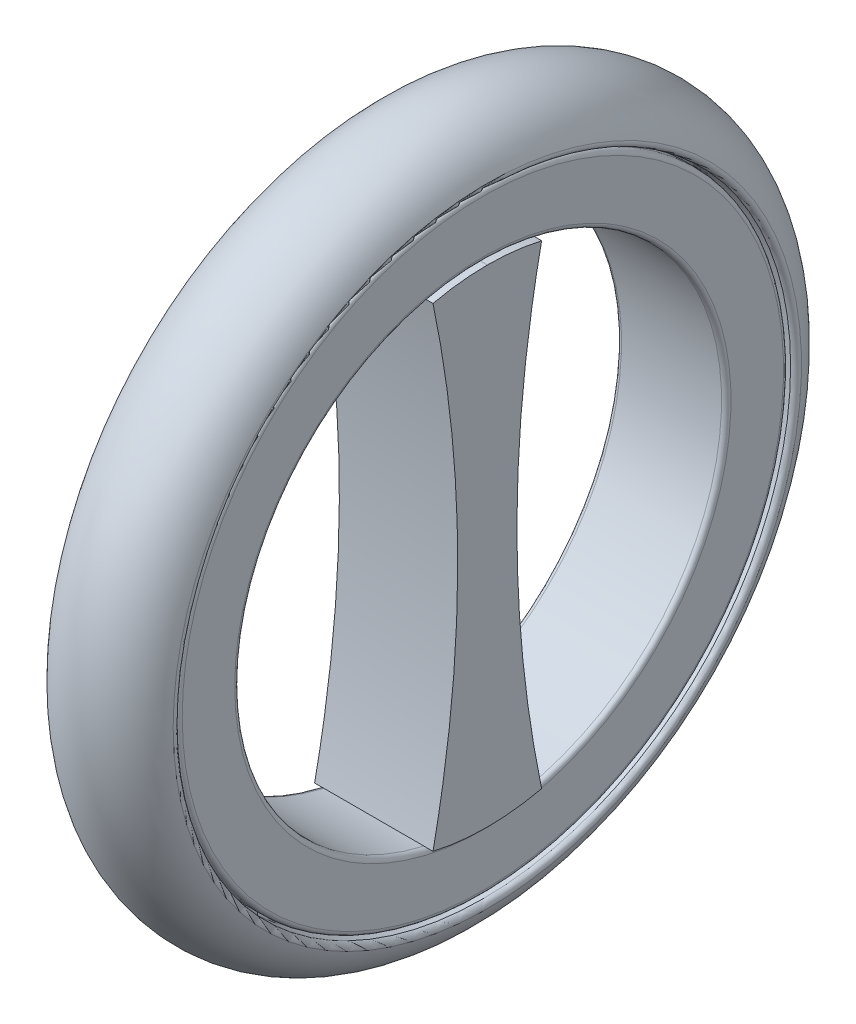
ISO-10303-21;
HEADER;
FILE_DESCRIPTION(('STEP AP214'),'2;1');
FILE_NAME('part.step','',(''),(''),'','','');
FILE_SCHEMA(('AUTOMOTIVE_DESIGN { 1 0 10303 214 1 1 1 1 }'));
ENDSEC;
DATA;
#1=APPLICATION_CONTEXT('core data for automotive mechanical design processes');
#2=APPLICATION_PROTOCOL_DEFINITION('international standard','automotive_design',2000,#1);
#3=PRODUCT_CONTEXT('',#1,'mechanical');
#4=PRODUCT('Part','Part','',(#3));
#5=PRODUCT_RELATED_PRODUCT_CATEGORY('part','',(#4));
#6=PRODUCT_DEFINITION_FORMATION('','',#4);
#7=PRODUCT_DEFINITION_CONTEXT('part definition',#1,'design');
#8=PRODUCT_DEFINITION('design','',#6,#7);
#9=PRODUCT_DEFINITION_SHAPE('','',#8);
#10=(LENGTH_UNIT() NAMED_UNIT(*) SI_UNIT(.MILLI.,.METRE.));
#11=(NAMED_UNIT(*) PLANE_ANGLE_UNIT() SI_UNIT($,.RADIAN.));
#12=(NAMED_UNIT(*) SI_UNIT($,.STERADIAN.) SOLID_ANGLE_UNIT());
#13=UNCERTAINTY_MEASURE_WITH_UNIT(LENGTH_MEASURE(1.E-05),#10,'distance_accuracy_value','');
#14=(GEOMETRIC_REPRESENTATION_CONTEXT(3) GLOBAL_UNCERTAINTY_ASSIGNED_CONTEXT((#13)) GLOBAL_UNIT_ASSIGNED_CONTEXT((#10,
#11,#12)) REPRESENTATION_CONTEXT('',''));
#15=CARTESIAN_POINT('',(0.,0.,0.));
#16=DIRECTION('',(0.,0.,1.));
#17=DIRECTION('',(1.,0.,0.));
#18=AXIS2_PLACEMENT_3D('',#15,#16,#17);
#19=CARTESIAN_POINT('',(-25.,100.208778222073,-22.9426211835391));
#20=CARTESIAN_POINT('',(-25.,102.79830451046,-11.6094366306029));
#21=CARTESIAN_POINT('',(-25.,102.801572089414,1.35689701375813E-06));
#22=B_SPLINE_CURVE_WITH_KNOTS('',2,(#19,#20,#21),.UNSPECIFIED.,.F.,.F.,(3,3),(0.,1.),.UNSPECIFIED.);
#23=DIRECTION('',(1.,0.,0.));
#24=VECTOR('',#23,1.);
#25=SURFACE_OF_LINEAR_EXTRUSION('',#22,#24);
#26=DIRECTION('',(1.,0.,0.));
#27=VECTOR('',#26,1.);
#28=CARTESIAN_POINT('',(-25.,102.801572089414,1.35689701375813E-06));
#29=LINE('',#28,#27);
#30=CARTESIAN_POINT('',(-25.,102.801572089414,1.35689701375813E-06));
#31=VERTEX_POINT('',#30);
#32=CARTESIAN_POINT('',(25.,102.801572089414,1.35689701375813E-06));
#33=VERTEX_POINT('',#32);
#34=EDGE_CURVE('E52',#31,#33,#29,.T.);
#35=ORIENTED_EDGE('',*,*,#34,.T.);
#36=CARTESIAN_POINT('',(25.,100.208778222073,-22.9426211835391));
#37=CARTESIAN_POINT('',(25.,102.79830451046,-11.6094366306029));
#38=CARTESIAN_POINT('',(25.,102.801572089414,1.35689701375813E-06));
#39=B_SPLINE_CURVE_WITH_KNOTS('',2,(#36,#37,#38),.UNSPECIFIED.,.F.,.F.,(3,3),(0.,1.),.UNSPECIFIED.);
#40=CARTESIAN_POINT('',(25.,100.208778222073,-22.9426211835391));
#41=VERTEX_POINT('',#40);
#42=EDGE_CURVE('E101',#41,#33,#39,.T.);
#43=ORIENTED_EDGE('',*,*,#42,.F.);
#44=DIRECTION('',(1.,0.,0.));
#45=VECTOR('',#44,1.);
#46=CARTESIAN_POINT('',(-25.,100.208778222073,-22.9426211835391));
#47=LINE('',#46,#45);
#48=CARTESIAN_POINT('',(-25.,100.208778222073,-22.9426211835391));
#49=VERTEX_POINT('',#48);
#50=EDGE_CURVE('E12',#49,#41,#47,.T.);
#51=ORIENTED_EDGE('',*,*,#50,.F.);
#52=EDGE_CURVE('E102',#49,#31,#22,.T.);
#53=ORIENTED_EDGE('',*,*,#52,.T.);
#54=EDGE_LOOP('',(#35,#43,#51,#53));
#55=FACE_BOUND('',#54,.T.);
#56=ADVANCED_FACE('F48',(#55),#25,.T.);
#57=CARTESIAN_POINT('',(-25.,-100.208768131223,-22.9426652583033));
#58=CARTESIAN_POINT('',(-25.,3.93838095107848E-07,-2.05940556611534));
#59=CARTESIAN_POINT('',(-25.,100.208778222073,-22.9426211835391));
#60=B_SPLINE_CURVE_WITH_KNOTS('',2,(#57,#58,#59),.UNSPECIFIED.,.F.,.F.,(3,3),(0.,1.),.UNSPECIFIED.);
#61=DIRECTION('',(1.,0.,0.));
#62=VECTOR('',#61,1.);
#63=SURFACE_OF_LINEAR_EXTRUSION('',#60,#62);
#64=ORIENTED_EDGE('',*,*,#50,.T.);
#65=CARTESIAN_POINT('',(25.,-100.208768131223,-22.9426652583033));
#66=CARTESIAN_POINT('',(25.,3.93838095107848E-07,-2.05940556611534));
#67=CARTESIAN_POINT('',(25.,100.208778222073,-22.9426211835391));
#68=B_SPLINE_CURVE_WITH_KNOTS('',2,(#65,#66,#67),.UNSPECIFIED.,.F.,.F.,(3,3),(0.,1.),.UNSPECIFIED.);
#69=CARTESIAN_POINT('',(25.,-100.208768131223,-22.9426652583033));
#70=VERTEX_POINT('',#69);
#71=EDGE_CURVE('E119',#70,#41,#68,.T.);
#72=ORIENTED_EDGE('',*,*,#71,.F.);
#73=DIRECTION('',(1.,0.,0.));
#74=VECTOR('',#73,1.);
#75=CARTESIAN_POINT('',(-25.,-100.208768131223,-22.9426652583033));
#76=LINE('',#75,#74);
#77=CARTESIAN_POINT('',(-25.,-100.208768131223,-22.9426652583033));
#78=VERTEX_POINT('',#77);
#79=EDGE_CURVE('E57',#78,#70,#76,.T.);
#80=ORIENTED_EDGE('',*,*,#79,.F.);
#81=EDGE_CURVE('E107',#78,#49,#60,.T.);
#82=ORIENTED_EDGE('',*,*,#81,.T.);
#83=EDGE_LOOP('',(#64,#72,#80,#82));
#84=FACE_BOUND('',#83,.T.);
#85=ADVANCED_FACE('F215',(#84),#63,.T.);
#86=CARTESIAN_POINT('',(-25.,-102.801572089414,1.35689701375813E-06));
#87=CARTESIAN_POINT('',(-25.,-102.800085456386,-11.5882971478864));
#88=CARTESIAN_POINT('',(-25.,-100.208768131223,-22.9426652583033));
#89=B_SPLINE_CURVE_WITH_KNOTS('',2,(#86,#87,#88),.UNSPECIFIED.,.F.,.F.,(3,3),(0.,1.),.UNSPECIFIED.);
#90=DIRECTION('',(1.,0.,0.));
#91=VECTOR('',#90,1.);
#92=SURFACE_OF_LINEAR_EXTRUSION('',#89,#91);
#93=ORIENTED_EDGE('',*,*,#79,.T.);
#94=CARTESIAN_POINT('',(25.,-102.801572089414,1.35689701375813E-06));
#95=CARTESIAN_POINT('',(25.,-102.800085456386,-11.5882971478864));
#96=CARTESIAN_POINT('',(25.,-100.208768131223,-22.9426652583033));
#97=B_SPLINE_CURVE_WITH_KNOTS('',2,(#94,#95,#96),.UNSPECIFIED.,.F.,.F.,(3,3),(0.,1.),.UNSPECIFIED.);
#98=CARTESIAN_POINT('',(25.,-102.801572089414,1.35689701375813E-06));
#99=VERTEX_POINT('',#98);
#100=EDGE_CURVE('E143',#99,#70,#97,.T.);
#101=ORIENTED_EDGE('',*,*,#100,.F.);
#102=DIRECTION('',(1.,0.,0.));
#103=VECTOR('',#102,1.);
#104=CARTESIAN_POINT('',(-25.,-102.801572089414,1.35689701375813E-06));
#105=LINE('',#104,#103);
#106=CARTESIAN_POINT('',(-25.,-102.801572089414,1.35689701375813E-06));
#107=VERTEX_POINT('',#106);
#108=EDGE_CURVE('E276',#107,#99,#105,.T.);
#109=ORIENTED_EDGE('',*,*,#108,.F.);
#110=EDGE_CURVE('E197',#107,#78,#89,.T.);
#111=ORIENTED_EDGE('',*,*,#110,.T.);
#112=EDGE_LOOP('',(#93,#101,#109,#111));
#113=FACE_BOUND('',#112,.T.);
#114=ADVANCED_FACE('F188',(#113),#92,.T.);
#115=CARTESIAN_POINT('',(-25.,-100.208768131223,22.9426679720973));
#116=CARTESIAN_POINT('',(-25.,-102.800085456386,11.5882998616804));
#117=CARTESIAN_POINT('',(-25.,-102.801572089414,1.35689701375813E-06));
#118=B_SPLINE_CURVE_WITH_KNOTS('',2,(#115,#116,#117),.UNSPECIFIED.,.F.,.F.,(3,3),(0.,1.),.UNSPECIFIED.);
#119=DIRECTION('',(1.,0.,0.));
#120=VECTOR('',#119,1.);
#121=SURFACE_OF_LINEAR_EXTRUSION('',#118,#120);
#122=ORIENTED_EDGE('',*,*,#108,.T.);
#123=CARTESIAN_POINT('',(25.,-100.208768131223,22.9426679720973));
#124=CARTESIAN_POINT('',(25.,-102.800085456386,11.5882998616804));
#125=CARTESIAN_POINT('',(25.,-102.801572089414,1.35689701375813E-06));
#126=B_SPLINE_CURVE_WITH_KNOTS('',2,(#123,#124,#125),.UNSPECIFIED.,.F.,.F.,(3,3),(0.,1.),.UNSPECIFIED.);
#127=CARTESIAN_POINT('',(25.,-100.208768131223,22.9426679720973));
#128=VERTEX_POINT('',#127);
#129=EDGE_CURVE('E135',#128,#99,#126,.T.);
#130=ORIENTED_EDGE('',*,*,#129,.F.);
#131=DIRECTION('',(1.,0.,0.));
#132=VECTOR('',#131,1.);
#133=CARTESIAN_POINT('',(-25.,-100.208768131223,22.9426679720973));
#134=LINE('',#133,#132);
#135=CARTESIAN_POINT('',(-25.,-100.208768131223,22.9426679720973));
#136=VERTEX_POINT('',#135);
#137=EDGE_CURVE('E281',#136,#128,#134,.T.);
#138=ORIENTED_EDGE('',*,*,#137,.F.);
#139=EDGE_CURVE('E192',#136,#107,#118,.T.);
#140=ORIENTED_EDGE('',*,*,#139,.T.);
#141=EDGE_LOOP('',(#122,#130,#138,#140));
#142=FACE_BOUND('',#141,.T.);
#143=ADVANCED_FACE('F184',(#142),#121,.T.);
#144=CARTESIAN_POINT('',(-25.,100.208778222073,22.9426238973332));
#145=CARTESIAN_POINT('',(-25.,3.93838126070602E-07,2.0594082799094));
#146=CARTESIAN_POINT('',(-25.,-100.208768131223,22.9426679720973));
#147=B_SPLINE_CURVE_WITH_KNOTS('',2,(#144,#145,#146),.UNSPECIFIED.,.F.,.F.,(3,3),(0.,1.),.UNSPECIFIED.);
#148=DIRECTION('',(1.,0.,0.));
#149=VECTOR('',#148,1.);
#150=SURFACE_OF_LINEAR_EXTRUSION('',#147,#149);
#151=ORIENTED_EDGE('',*,*,#137,.T.);
#152=CARTESIAN_POINT('',(25.,100.208778222073,22.9426238973332));
#153=CARTESIAN_POINT('',(25.,3.93838126070602E-07,2.0594082799094));
#154=CARTESIAN_POINT('',(25.,-100.208768131223,22.9426679720973));
#155=B_SPLINE_CURVE_WITH_KNOTS('',2,(#152,#153,#154),.UNSPECIFIED.,.F.,.F.,(3,3),(0.,1.),.UNSPECIFIED.);
#156=CARTESIAN_POINT('',(25.,100.208778222073,22.9426238973332));
#157=VERTEX_POINT('',#156);
#158=EDGE_CURVE('E114',#157,#128,#155,.T.);
#159=ORIENTED_EDGE('',*,*,#158,.F.);
#160=DIRECTION('',(1.,0.,0.));
#161=VECTOR('',#160,1.);
#162=CARTESIAN_POINT('',(-25.,100.208778222073,22.9426238973332));
#163=LINE('',#162,#161);
#164=CARTESIAN_POINT('',(-25.,100.208778222073,22.9426238973332));
#165=VERTEX_POINT('',#164);
#166=EDGE_CURVE('E106',#165,#157,#163,.T.);
#167=ORIENTED_EDGE('',*,*,#166,.F.);
#168=EDGE_CURVE('E170',#165,#136,#147,.T.);
#169=ORIENTED_EDGE('',*,*,#168,.T.);
#170=EDGE_LOOP('',(#151,#159,#167,#169));
#171=FACE_BOUND('',#170,.T.);
#172=ADVANCED_FACE('F181',(#171),#150,.T.);
#173=CARTESIAN_POINT('',(-25.,102.801572089414,1.35689701375813E-06));
#174=CARTESIAN_POINT('',(-25.,102.79830451046,11.6094393443969));
#175=CARTESIAN_POINT('',(-25.,100.208778222073,22.9426238973332));
#176=B_SPLINE_CURVE_WITH_KNOTS('',2,(#173,#174,#175),.UNSPECIFIED.,.F.,.F.,(3,3),(0.,1.),.UNSPECIFIED.);
#177=DIRECTION('',(1.,0.,0.));
#178=VECTOR('',#177,1.);
#179=SURFACE_OF_LINEAR_EXTRUSION('',#176,#178);
#180=ORIENTED_EDGE('',*,*,#166,.T.);
#181=CARTESIAN_POINT('',(25.,102.801572089414,1.35689701375813E-06));
#182=CARTESIAN_POINT('',(25.,102.79830451046,11.6094393443969));
#183=CARTESIAN_POINT('',(25.,100.208778222073,22.9426238973332));
#184=B_SPLINE_CURVE_WITH_KNOTS('',2,(#181,#182,#183),.UNSPECIFIED.,.F.,.F.,(3,3),(0.,1.),.UNSPECIFIED.);
#185=EDGE_CURVE('E109',#33,#157,#184,.T.);
#186=ORIENTED_EDGE('',*,*,#185,.F.);
#187=ORIENTED_EDGE('',*,*,#34,.F.);
#188=EDGE_CURVE('E162',#31,#165,#176,.T.);
#189=ORIENTED_EDGE('',*,*,#188,.T.);
#190=EDGE_LOOP('',(#180,#186,#187,#189));
#191=FACE_BOUND('',#190,.T.);
#192=ADVANCED_FACE('F110',(#191),#179,.T.);
#193=CARTESIAN_POINT('',(-25.,102.151739833102,-11.540373271962));
#194=DIRECTION('',(-1.,0.,0.));
#195=DIRECTION('',(0.,0.,1.));
#196=AXIS2_PLACEMENT_3D('',#193,#194,#195);
#197=PLANE('',#196);
#198=ORIENTED_EDGE('',*,*,#52,.F.);
#199=ORIENTED_EDGE('',*,*,#81,.F.);
#200=ORIENTED_EDGE('',*,*,#110,.F.);
#201=ORIENTED_EDGE('',*,*,#139,.F.);
#202=ORIENTED_EDGE('',*,*,#168,.F.);
#203=ORIENTED_EDGE('',*,*,#188,.F.);
#204=EDGE_LOOP('',(#198,#199,#200,#201,#202,#203));
#205=FACE_BOUND('',#204,.T.);
#206=ADVANCED_FACE('F180',(#205),#197,.T.);
#207=CARTESIAN_POINT('',(25.,102.151739833102,-11.540373271962));
#208=DIRECTION('',(-1.,0.,0.));
#209=DIRECTION('',(0.,0.,1.));
#210=AXIS2_PLACEMENT_3D('',#207,#208,#209);
#211=PLANE('',#210);
#212=ORIENTED_EDGE('',*,*,#42,.T.);
#213=ORIENTED_EDGE('',*,*,#185,.T.);
#214=ORIENTED_EDGE('',*,*,#158,.T.);
#215=ORIENTED_EDGE('',*,*,#129,.T.);
#216=ORIENTED_EDGE('',*,*,#100,.T.);
#217=ORIENTED_EDGE('',*,*,#71,.T.);
#218=EDGE_LOOP('',(#212,#213,#214,#215,#216,#217));
#219=FACE_BOUND('',#218,.T.);
#220=ADVANCED_FACE('F117',(#219),#211,.F.);
#221=CLOSED_SHELL('',(#56,#85,#114,#143,#172,#192,#206,#220));
#222=MANIFOLD_SOLID_BREP('B2',#221);
#223=CARTESIAN_POINT('',(21.1278448465034,0.,0.));
#224=DIRECTION('',(-1.,0.,0.));
#225=DIRECTION('',(0.,0.,1.));
#226=AXIS2_PLACEMENT_3D('',#223,#224,#225);
#227=TOROIDAL_SURFACE('',#226,104.801572089414,1.99999999999999);
#228=CARTESIAN_POINT('',(23.1278448465034,0.,0.));
#229=DIRECTION('',(-1.,0.,0.));
#230=DIRECTION('',(0.,0.,1.));
#231=AXIS2_PLACEMENT_3D('',#228,#229,#230);
#232=CIRCLE('',#231,104.801572089414);
#233=CARTESIAN_POINT('',(23.1278448465034,0.,104.801572089414));
#234=VERTEX_POINT('',#233);
#235=EDGE_CURVE('E349',#234,#234,#232,.T.);
#236=ORIENTED_EDGE('',*,*,#235,.F.);
#237=EDGE_LOOP('',(#236));
#238=FACE_BOUND('',#237,.T.);
#239=CARTESIAN_POINT('',(21.1278448465034,0.,0.));
#240=DIRECTION('',(-1.,0.,0.));
#241=DIRECTION('',(0.,0.,1.));
#242=AXIS2_PLACEMENT_3D('',#239,#240,#241);
#243=CIRCLE('',#242,102.801572089414);
#244=CARTESIAN_POINT('',(21.1278448465034,0.,102.801572089414));
#245=VERTEX_POINT('',#244);
#246=EDGE_CURVE('E47',#245,#245,#243,.T.);
#247=ORIENTED_EDGE('',*,*,#246,.T.);
#248=EDGE_LOOP('',(#247));
#249=FACE_BOUND('',#248,.T.);
#250=ADVANCED_FACE('F297',(#238,#249),#227,.T.);
#251=CARTESIAN_POINT('',(-27.5,0.,0.));
#252=DIRECTION('',(-1.,0.,0.));
#253=DIRECTION('',(0.,0.,1.));
#254=AXIS2_PLACEMENT_3D('',#251,#252,#253);
#255=CYLINDRICAL_SURFACE('',#254,102.801572089414);
#256=ORIENTED_EDGE('',*,*,#246,.F.);
#257=EDGE_LOOP('',(#256));
#258=FACE_BOUND('',#257,.T.);
#259=CARTESIAN_POINT('',(-21.1278448465034,0.,0.));
#260=DIRECTION('',(-1.,0.,0.));
#261=DIRECTION('',(0.,0.,1.));
#262=AXIS2_PLACEMENT_3D('',#259,#260,#261);
#263=CIRCLE('',#262,102.801572089414);
#264=CARTESIAN_POINT('',(-21.1278448465034,0.,102.801572089414));
#265=VERTEX_POINT('',#264);
#266=EDGE_CURVE('E303',#265,#265,#263,.T.);
#267=ORIENTED_EDGE('',*,*,#266,.T.);
#268=EDGE_LOOP('',(#267));
#269=FACE_BOUND('',#268,.T.);
#270=ADVANCED_FACE('F356',(#258,#269),#255,.F.);
#271=CARTESIAN_POINT('',(-21.1278448465034,0.,0.));
#272=DIRECTION('',(-1.,0.,0.));
#273=DIRECTION('',(0.,0.,1.));
#274=AXIS2_PLACEMENT_3D('',#271,#272,#273);
#275=TOROIDAL_SURFACE('',#274,104.801572089414,1.99999999999999);
#276=ORIENTED_EDGE('',*,*,#266,.F.);
#277=EDGE_LOOP('',(#276));
#278=FACE_BOUND('',#277,.T.);
#279=CARTESIAN_POINT('',(-23.1278448465034,0.,0.));
#280=DIRECTION('',(-1.,0.,0.));
#281=DIRECTION('',(0.,0.,1.));
#282=AXIS2_PLACEMENT_3D('',#279,#280,#281);
#283=CIRCLE('',#282,104.801572089414);
#284=CARTESIAN_POINT('',(-23.1278448465034,0.,104.801572089414));
#285=VERTEX_POINT('',#284);
#286=EDGE_CURVE('E307',#285,#285,#283,.T.);
#287=ORIENTED_EDGE('',*,*,#286,.T.);
#288=EDGE_LOOP('',(#287));
#289=FACE_BOUND('',#288,.T.);
#290=ADVANCED_FACE('F360',(#278,#289),#275,.T.);
#291=CARTESIAN_POINT('',(-23.1278448465034,104.801572089414,0.));
#292=DIRECTION('',(1.,0.,0.));
#293=DIRECTION('',(0.,0.,-1.));
#294=AXIS2_PLACEMENT_3D('',#291,#292,#293);
#295=PLANE('',#294);
#296=ORIENTED_EDGE('',*,*,#286,.F.);
#297=EDGE_LOOP('',(#296));
#298=FACE_BOUND('',#297,.T.);
#299=CARTESIAN_POINT('',(-23.1278448465034,0.,0.));
#300=DIRECTION('',(-1.,0.,0.));
#301=DIRECTION('',(0.,0.,1.));
#302=AXIS2_PLACEMENT_3D('',#299,#300,#301);
#303=CIRCLE('',#302,126.984643660724);
#304=CARTESIAN_POINT('',(-23.1278448465034,0.,126.984643660724));
#305=VERTEX_POINT('',#304);
#306=EDGE_CURVE('E311',#305,#305,#303,.T.);
#307=ORIENTED_EDGE('',*,*,#306,.T.);
#308=EDGE_LOOP('',(#307));
#309=FACE_BOUND('',#308,.T.);
#310=ADVANCED_FACE('F365',(#298,#309),#295,.F.);
#311=CARTESIAN_POINT('',(-21.1278448465034,0.,0.));
#312=DIRECTION('',(-1.,0.,0.));
#313=DIRECTION('',(0.,0.,1.));
#314=AXIS2_PLACEMENT_3D('',#311,#312,#313);
#315=TOROIDAL_SURFACE('',#314,126.984643660724,2.);
#316=ORIENTED_EDGE('',*,*,#306,.F.);
#317=EDGE_LOOP('',(#316));
#318=FACE_BOUND('',#317,.T.);
#319=CARTESIAN_POINT('',(-21.1278448465034,0.,0.));
#320=DIRECTION('',(-1.,0.,0.));
#321=DIRECTION('',(0.,0.,1.));
#322=AXIS2_PLACEMENT_3D('',#319,#320,#321);
#323=CIRCLE('',#322,128.984643660724);
#324=CARTESIAN_POINT('',(-21.1278448465034,0.,128.984643660724));
#325=VERTEX_POINT('',#324);
#326=EDGE_CURVE('E316',#325,#325,#323,.T.);
#327=ORIENTED_EDGE('',*,*,#326,.T.);
#328=EDGE_LOOP('',(#327));
#329=FACE_BOUND('',#328,.T.);
#330=ADVANCED_FACE('F371',(#318,#329),#315,.T.);
#331=CARTESIAN_POINT('',(-27.5,0.,0.));
#332=DIRECTION('',(-1.,0.,0.));
#333=DIRECTION('',(0.,0.,1.));
#334=AXIS2_PLACEMENT_3D('',#331,#332,#333);
#335=CYLINDRICAL_SURFACE('',#334,128.984643660724);
#336=ORIENTED_EDGE('',*,*,#326,.F.);
#337=EDGE_LOOP('',(#336));
#338=FACE_BOUND('',#337,.T.);
#339=CARTESIAN_POINT('',(-16.274578516263,0.,0.));
#340=DIRECTION('',(-1.,0.,0.));
#341=DIRECTION('',(0.,0.,1.));
#342=AXIS2_PLACEMENT_3D('',#339,#340,#341);
#343=CIRCLE('',#342,128.984643660724);
#344=CARTESIAN_POINT('',(-16.274578516263,0.,128.984643660724));
#345=VERTEX_POINT('',#344);
#346=EDGE_CURVE('E319',#345,#345,#343,.T.);
#347=ORIENTED_EDGE('',*,*,#346,.T.);
#348=EDGE_LOOP('',(#347));
#349=FACE_BOUND('',#348,.T.);
#350=ADVANCED_FACE('F375',(#338,#349),#335,.T.);
#351=CARTESIAN_POINT('',(-16.274578516263,0.,0.));
#352=DIRECTION('',(-1.,0.,0.));
#353=DIRECTION('',(0.,0.,1.));
#354=AXIS2_PLACEMENT_3D('',#351,#352,#353);
#355=TOROIDAL_SURFACE('',#354,127.984643660724,1.00000000000002);
#356=ORIENTED_EDGE('',*,*,#346,.F.);
#357=EDGE_LOOP('',(#356));
#358=FACE_BOUND('',#357,.T.);
#359=CARTESIAN_POINT('',(-15.274578516263,0.,0.));
#360=DIRECTION('',(-1.,0.,0.));
#361=DIRECTION('',(0.,0.,1.));
#362=AXIS2_PLACEMENT_3D('',#359,#360,#361);
#363=CIRCLE('',#362,127.984643660724);
#364=CARTESIAN_POINT('',(-15.274578516263,0.,127.984643660724));
#365=VERTEX_POINT('',#364);
#366=EDGE_CURVE('E322',#365,#365,#363,.T.);
#367=ORIENTED_EDGE('',*,*,#366,.T.);
#368=EDGE_LOOP('',(#367));
#369=FACE_BOUND('',#368,.T.);
#370=ADVANCED_FACE('F379',(#358,#369),#355,.T.);
#371=CARTESIAN_POINT('',(-15.274578516263,125.292811812837,0.));
#372=DIRECTION('',(-1.,0.,0.));
#373=DIRECTION('',(0.,0.,1.));
#374=AXIS2_PLACEMENT_3D('',#371,#372,#373);
#375=PLANE('',#374);
#376=ORIENTED_EDGE('',*,*,#366,.F.);
#377=EDGE_LOOP('',(#376));
#378=FACE_BOUND('',#377,.T.);
#379=CARTESIAN_POINT('',(-15.274578516263,0.,0.));
#380=DIRECTION('',(-1.,0.,0.));
#381=DIRECTION('',(0.,0.,1.));
#382=AXIS2_PLACEMENT_3D('',#379,#380,#381);
#383=CIRCLE('',#382,125.292811812837);
#384=CARTESIAN_POINT('',(-15.274578516263,0.,125.292811812837));
#385=VERTEX_POINT('',#384);
#386=EDGE_CURVE('E325',#385,#385,#383,.T.);
#387=ORIENTED_EDGE('',*,*,#386,.T.);
#388=EDGE_LOOP('',(#387));
#389=FACE_BOUND('',#388,.T.);
#390=ADVANCED_FACE('F383',(#378,#389),#375,.F.);
#391=CARTESIAN_POINT('',(-12.274578516263,0.,0.));
#392=DIRECTION('',(-1.,0.,0.));
#393=DIRECTION('',(0.,0.,1.));
#394=AXIS2_PLACEMENT_3D('',#391,#392,#393);
#395=TOROIDAL_SURFACE('',#394,125.292811812837,3.);
#396=ORIENTED_EDGE('',*,*,#386,.F.);
#397=EDGE_LOOP('',(#396));
#398=FACE_BOUND('',#397,.T.);
#399=CARTESIAN_POINT('',(-12.274578516263,0.,0.));
#400=DIRECTION('',(-1.,0.,0.));
#401=DIRECTION('',(0.,0.,1.));
#402=AXIS2_PLACEMENT_3D('',#399,#400,#401);
#403=CIRCLE('',#402,122.292811812837);
#404=CARTESIAN_POINT('',(-12.274578516263,0.,122.292811812837));
#405=VERTEX_POINT('',#404);
#406=EDGE_CURVE('E328',#405,#405,#403,.T.);
#407=ORIENTED_EDGE('',*,*,#406,.T.);
#408=EDGE_LOOP('',(#407));
#409=FACE_BOUND('',#408,.T.);
#410=ADVANCED_FACE('F387',(#398,#409),#395,.F.);
#411=CARTESIAN_POINT('',(-27.5,0.,0.));
#412=DIRECTION('',(-1.,0.,0.));
#413=DIRECTION('',(0.,0.,1.));
#414=AXIS2_PLACEMENT_3D('',#411,#412,#413);
#415=CYLINDRICAL_SURFACE('',#414,122.292811812837);
#416=ORIENTED_EDGE('',*,*,#406,.F.);
#417=EDGE_LOOP('',(#416));
#418=FACE_BOUND('',#417,.T.);
#419=CARTESIAN_POINT('',(12.274578516263,0.,0.));
#420=DIRECTION('',(-1.,0.,0.));
#421=DIRECTION('',(0.,0.,1.));
#422=AXIS2_PLACEMENT_3D('',#419,#420,#421);
#423=CIRCLE('',#422,122.292811812837);
#424=CARTESIAN_POINT('',(12.274578516263,0.,122.292811812837));
#425=VERTEX_POINT('',#424);
#426=EDGE_CURVE('E331',#425,#425,#423,.T.);
#427=ORIENTED_EDGE('',*,*,#426,.T.);
#428=EDGE_LOOP('',(#427));
#429=FACE_BOUND('',#428,.T.);
#430=ADVANCED_FACE('F391',(#418,#429),#415,.T.);
#431=CARTESIAN_POINT('',(12.274578516263,0.,0.));
#432=DIRECTION('',(-1.,0.,0.));
#433=DIRECTION('',(0.,0.,1.));
#434=AXIS2_PLACEMENT_3D('',#431,#432,#433);
#435=TOROIDAL_SURFACE('',#434,125.292811812837,2.99999999999998);
#436=ORIENTED_EDGE('',*,*,#426,.F.);
#437=EDGE_LOOP('',(#436));
#438=FACE_BOUND('',#437,.T.);
#439=CARTESIAN_POINT('',(15.274578516263,0.,0.));
#440=DIRECTION('',(-1.,0.,0.));
#441=DIRECTION('',(0.,0.,1.));
#442=AXIS2_PLACEMENT_3D('',#439,#440,#441);
#443=CIRCLE('',#442,125.292811812837);
#444=CARTESIAN_POINT('',(15.274578516263,0.,125.292811812837));
#445=VERTEX_POINT('',#444);
#446=EDGE_CURVE('E334',#445,#445,#443,.T.);
#447=ORIENTED_EDGE('',*,*,#446,.T.);
#448=EDGE_LOOP('',(#447));
#449=FACE_BOUND('',#448,.T.);
#450=ADVANCED_FACE('F395',(#438,#449),#435,.F.);
#451=CARTESIAN_POINT('',(15.274578516263,125.292811812837,0.));
#452=DIRECTION('',(1.,0.,0.));
#453=DIRECTION('',(0.,0.,-1.));
#454=AXIS2_PLACEMENT_3D('',#451,#452,#453);
#455=PLANE('',#454);
#456=ORIENTED_EDGE('',*,*,#446,.F.);
#457=EDGE_LOOP('',(#456));
#458=FACE_BOUND('',#457,.T.);
#459=CARTESIAN_POINT('',(15.274578516263,0.,0.));
#460=DIRECTION('',(-1.,0.,0.));
#461=DIRECTION('',(0.,0.,1.));
#462=AXIS2_PLACEMENT_3D('',#459,#460,#461);
#463=CIRCLE('',#462,127.984643660724);
#464=CARTESIAN_POINT('',(15.274578516263,0.,127.984643660724));
#465=VERTEX_POINT('',#464);
#466=EDGE_CURVE('E337',#465,#465,#463,.T.);
#467=ORIENTED_EDGE('',*,*,#466,.T.);
#468=EDGE_LOOP('',(#467));
#469=FACE_BOUND('',#468,.T.);
#470=ADVANCED_FACE('F399',(#458,#469),#455,.F.);
#471=CARTESIAN_POINT('',(16.274578516263,0.,0.));
#472=DIRECTION('',(-1.,0.,0.));
#473=DIRECTION('',(0.,0.,1.));
#474=AXIS2_PLACEMENT_3D('',#471,#472,#473);
#475=TOROIDAL_SURFACE('',#474,127.984643660724,0.999999999999999);
#476=ORIENTED_EDGE('',*,*,#466,.F.);
#477=EDGE_LOOP('',(#476));
#478=FACE_BOUND('',#477,.T.);
#479=CARTESIAN_POINT('',(16.274578516263,0.,0.));
#480=DIRECTION('',(-1.,0.,0.));
#481=DIRECTION('',(0.,0.,1.));
#482=AXIS2_PLACEMENT_3D('',#479,#480,#481);
#483=CIRCLE('',#482,128.984643660724);
#484=CARTESIAN_POINT('',(16.274578516263,0.,128.984643660724));
#485=VERTEX_POINT('',#484);
#486=EDGE_CURVE('E340',#485,#485,#483,.T.);
#487=ORIENTED_EDGE('',*,*,#486,.T.);
#488=EDGE_LOOP('',(#487));
#489=FACE_BOUND('',#488,.T.);
#490=ADVANCED_FACE('F403',(#478,#489),#475,.T.);
#491=CARTESIAN_POINT('',(-27.5,0.,0.));
#492=DIRECTION('',(-1.,0.,0.));
#493=DIRECTION('',(0.,0.,1.));
#494=AXIS2_PLACEMENT_3D('',#491,#492,#493);
#495=CYLINDRICAL_SURFACE('',#494,128.984643660724);
#496=ORIENTED_EDGE('',*,*,#486,.F.);
#497=EDGE_LOOP('',(#496));
#498=FACE_BOUND('',#497,.T.);
#499=CARTESIAN_POINT('',(21.1278448465034,0.,0.));
#500=DIRECTION('',(-1.,0.,0.));
#501=DIRECTION('',(0.,0.,1.));
#502=AXIS2_PLACEMENT_3D('',#499,#500,#501);
#503=CIRCLE('',#502,128.984643660724);
#504=CARTESIAN_POINT('',(21.1278448465034,0.,128.984643660724));
#505=VERTEX_POINT('',#504);
#506=EDGE_CURVE('E343',#505,#505,#503,.T.);
#507=ORIENTED_EDGE('',*,*,#506,.T.);
#508=EDGE_LOOP('',(#507));
#509=FACE_BOUND('',#508,.T.);
#510=ADVANCED_FACE('F407',(#498,#509),#495,.T.);
#511=CARTESIAN_POINT('',(21.1278448465034,0.,0.));
#512=DIRECTION('',(-1.,0.,0.));
#513=DIRECTION('',(0.,0.,1.));
#514=AXIS2_PLACEMENT_3D('',#511,#512,#513);
#515=TOROIDAL_SURFACE('',#514,126.984643660724,2.);
#516=ORIENTED_EDGE('',*,*,#506,.F.);
#517=EDGE_LOOP('',(#516));
#518=FACE_BOUND('',#517,.T.);
#519=CARTESIAN_POINT('',(23.1278448465034,0.,0.));
#520=DIRECTION('',(-1.,0.,0.));
#521=DIRECTION('',(0.,0.,1.));
#522=AXIS2_PLACEMENT_3D('',#519,#520,#521);
#523=CIRCLE('',#522,126.984643660724);
#524=CARTESIAN_POINT('',(23.1278448465034,0.,126.984643660724));
#525=VERTEX_POINT('',#524);
#526=EDGE_CURVE('E346',#525,#525,#523,.T.);
#527=ORIENTED_EDGE('',*,*,#526,.T.);
#528=EDGE_LOOP('',(#527));
#529=FACE_BOUND('',#528,.T.);
#530=ADVANCED_FACE('F411',(#518,#529),#515,.T.);
#531=CARTESIAN_POINT('',(23.1278448465034,104.801572089414,0.));
#532=DIRECTION('',(-1.,0.,0.));
#533=DIRECTION('',(0.,0.,1.));
#534=AXIS2_PLACEMENT_3D('',#531,#532,#533);
#535=PLANE('',#534);
#536=ORIENTED_EDGE('',*,*,#526,.F.);
#537=EDGE_LOOP('',(#536));
#538=FACE_BOUND('',#537,.T.);
#539=ORIENTED_EDGE('',*,*,#235,.T.);
#540=EDGE_LOOP('',(#539));
#541=FACE_BOUND('',#540,.T.);
#542=ADVANCED_FACE('F353',(#538,#541),#535,.F.);
#543=CLOSED_SHELL('',(#250,#270,#290,#310,#330,#350,#370,#390,#410,#430,#450,#470,#490,#510,
#530,#542));
#544=MANIFOLD_SOLID_BREP('B6',#543);
#545=CARTESIAN_POINT('',(-16.274578516263,0.,0.));
#546=DIRECTION('',(-1.,0.,0.));
#547=DIRECTION('',(0.,0.,1.));
#548=AXIS2_PLACEMENT_3D('',#545,#546,#547);
#549=TOROIDAL_SURFACE('',#548,127.984643660724,2.00000000000001);
#550=CARTESIAN_POINT('',(-14.274578516263,0.,0.));
#551=DIRECTION('',(-1.,0.,0.));
#552=DIRECTION('',(0.,0.,1.));
#553=AXIS2_PLACEMENT_3D('',#550,#551,#552);
#554=CIRCLE('',#553,127.984643660724);
#555=CARTESIAN_POINT('',(-14.274578516263,0.,127.984643660724));
#556=VERTEX_POINT('',#555);
#557=EDGE_CURVE('E296',#556,#556,#554,.T.);
#558=ORIENTED_EDGE('',*,*,#557,.F.);
#559=EDGE_LOOP('',(#558));
#560=FACE_BOUND('',#559,.T.);
#561=CARTESIAN_POINT('',(-16.274578516263,0.,0.));
#562=DIRECTION('',(-1.,0.,0.));
#563=DIRECTION('',(0.,0.,1.));
#564=AXIS2_PLACEMENT_3D('',#561,#562,#563);
#565=CIRCLE('',#564,129.984643660724);
#566=CARTESIAN_POINT('',(-16.274578516263,0.,129.984643660724));
#567=VERTEX_POINT('',#566);
#568=EDGE_CURVE('E585',#567,#567,#565,.T.);
#569=ORIENTED_EDGE('',*,*,#568,.T.);
#570=EDGE_LOOP('',(#569));
#571=FACE_BOUND('',#570,.T.);
#572=ADVANCED_FACE('F545',(#560,#571),#549,.F.);
#573=CARTESIAN_POINT('',(-14.274578516263,125.292811812837,0.));
#574=DIRECTION('',(1.,0.,0.));
#575=DIRECTION('',(0.,0.,-1.));
#576=AXIS2_PLACEMENT_3D('',#573,#574,#575);
#577=PLANE('',#576);
#578=CARTESIAN_POINT('',(-14.274578516263,0.,0.));
#579=DIRECTION('',(-1.,0.,0.));
#580=DIRECTION('',(0.,0.,1.));
#581=AXIS2_PLACEMENT_3D('',#578,#579,#580);
#582=CIRCLE('',#581,125.292811812837);
#583=CARTESIAN_POINT('',(-14.274578516263,0.,125.292811812837));
#584=VERTEX_POINT('',#583);
#585=EDGE_CURVE('E551',#584,#584,#582,.T.);
#586=ORIENTED_EDGE('',*,*,#585,.F.);
#587=EDGE_LOOP('',(#586));
#588=FACE_BOUND('',#587,.T.);
#589=ORIENTED_EDGE('',*,*,#557,.T.);
#590=EDGE_LOOP('',(#589));
#591=FACE_BOUND('',#590,.T.);
#592=ADVANCED_FACE('F646',(#588,#591),#577,.F.);
#593=CARTESIAN_POINT('',(-12.274578516263,0.,0.));
#594=DIRECTION('',(-1.,0.,0.));
#595=DIRECTION('',(0.,0.,1.));
#596=AXIS2_PLACEMENT_3D('',#593,#594,#595);
#597=TOROIDAL_SURFACE('',#596,125.292811812837,1.99999999999999);
#598=CARTESIAN_POINT('',(-12.274578516263,0.,0.));
#599=DIRECTION('',(-1.,0.,0.));
#600=DIRECTION('',(0.,0.,1.));
#601=AXIS2_PLACEMENT_3D('',#598,#599,#600);
#602=CIRCLE('',#601,123.292811812837);
#603=CARTESIAN_POINT('',(-12.274578516263,0.,123.292811812837));
#604=VERTEX_POINT('',#603);
#605=EDGE_CURVE('E555',#604,#604,#602,.T.);
#606=ORIENTED_EDGE('',*,*,#605,.F.);
#607=EDGE_LOOP('',(#606));
#608=FACE_BOUND('',#607,.T.);
#609=ORIENTED_EDGE('',*,*,#585,.T.);
#610=EDGE_LOOP('',(#609));
#611=FACE_BOUND('',#610,.T.);
#612=ADVANCED_FACE('F641',(#608,#611),#597,.T.);
#613=CARTESIAN_POINT('',(-27.5,0.,0.));
#614=DIRECTION('',(-1.,0.,0.));
#615=DIRECTION('',(0.,0.,1.));
#616=AXIS2_PLACEMENT_3D('',#613,#614,#615);
#617=CYLINDRICAL_SURFACE('',#616,123.292811812837);
#618=CARTESIAN_POINT('',(12.274578516263,0.,0.));
#619=DIRECTION('',(-1.,0.,0.));
#620=DIRECTION('',(0.,0.,1.));
#621=AXIS2_PLACEMENT_3D('',#618,#619,#620);
#622=CIRCLE('',#621,123.292811812837);
#623=CARTESIAN_POINT('',(12.274578516263,0.,123.292811812837));
#624=VERTEX_POINT('',#623);
#625=EDGE_CURVE('E559',#624,#624,#622,.T.);
#626=ORIENTED_EDGE('',*,*,#625,.F.);
#627=EDGE_LOOP('',(#626));
#628=FACE_BOUND('',#627,.T.);
#629=ORIENTED_EDGE('',*,*,#605,.T.);
#630=EDGE_LOOP('',(#629));
#631=FACE_BOUND('',#630,.T.);
#632=ADVANCED_FACE('F635',(#628,#631),#617,.F.);
#633=CARTESIAN_POINT('',(12.274578516263,0.,0.));
#634=DIRECTION('',(-1.,0.,0.));
#635=DIRECTION('',(0.,0.,1.));
#636=AXIS2_PLACEMENT_3D('',#633,#634,#635);
#637=TOROIDAL_SURFACE('',#636,125.292811812837,1.99999999999999);
#638=CARTESIAN_POINT('',(14.274578516263,0.,0.));
#639=DIRECTION('',(-1.,0.,0.));
#640=DIRECTION('',(0.,0.,1.));
#641=AXIS2_PLACEMENT_3D('',#638,#639,#640);
#642=CIRCLE('',#641,125.292811812837);
#643=CARTESIAN_POINT('',(14.274578516263,0.,125.292811812837));
#644=VERTEX_POINT('',#643);
#645=EDGE_CURVE('E564',#644,#644,#642,.T.);
#646=ORIENTED_EDGE('',*,*,#645,.F.);
#647=EDGE_LOOP('',(#646));
#648=FACE_BOUND('',#647,.T.);
#649=ORIENTED_EDGE('',*,*,#625,.T.);
#650=EDGE_LOOP('',(#649));
#651=FACE_BOUND('',#650,.T.);
#652=ADVANCED_FACE('F629',(#648,#651),#637,.T.);
#653=CARTESIAN_POINT('',(14.274578516263,125.292811812837,0.));
#654=DIRECTION('',(-1.,0.,0.));
#655=DIRECTION('',(0.,0.,1.));
#656=AXIS2_PLACEMENT_3D('',#653,#654,#655);
#657=PLANE('',#656);
#658=CARTESIAN_POINT('',(14.274578516263,0.,0.));
#659=DIRECTION('',(-1.,0.,0.));
#660=DIRECTION('',(0.,0.,1.));
#661=AXIS2_PLACEMENT_3D('',#658,#659,#660);
#662=CIRCLE('',#661,127.984643660724);
#663=CARTESIAN_POINT('',(14.274578516263,0.,127.984643660724));
#664=VERTEX_POINT('',#663);
#665=EDGE_CURVE('E567',#664,#664,#662,.T.);
#666=ORIENTED_EDGE('',*,*,#665,.F.);
#667=EDGE_LOOP('',(#666));
#668=FACE_BOUND('',#667,.T.);
#669=ORIENTED_EDGE('',*,*,#645,.T.);
#670=EDGE_LOOP('',(#669));
#671=FACE_BOUND('',#670,.T.);
#672=ADVANCED_FACE('F623',(#668,#671),#657,.F.);
#673=CARTESIAN_POINT('',(16.274578516263,0.,0.));
#674=DIRECTION('',(-1.,0.,0.));
#675=DIRECTION('',(0.,0.,1.));
#676=AXIS2_PLACEMENT_3D('',#673,#674,#675);
#677=TOROIDAL_SURFACE('',#676,127.984643660724,2.00000000000001);
#678=CARTESIAN_POINT('',(16.274578516263,0.,0.));
#679=DIRECTION('',(-1.,0.,0.));
#680=DIRECTION('',(0.,0.,1.));
#681=AXIS2_PLACEMENT_3D('',#678,#679,#680);
#682=CIRCLE('',#681,129.984643660724);
#683=CARTESIAN_POINT('',(16.274578516263,0.,129.984643660724));
#684=VERTEX_POINT('',#683);
#685=EDGE_CURVE('E570',#684,#684,#682,.T.);
#686=ORIENTED_EDGE('',*,*,#685,.F.);
#687=EDGE_LOOP('',(#686));
#688=FACE_BOUND('',#687,.T.);
#689=ORIENTED_EDGE('',*,*,#665,.T.);
#690=EDGE_LOOP('',(#689));
#691=FACE_BOUND('',#690,.T.);
#692=ADVANCED_FACE('F617',(#688,#691),#677,.F.);
#693=CARTESIAN_POINT('',(-27.5,0.,0.));
#694=DIRECTION('',(-1.,0.,0.));
#695=DIRECTION('',(0.,0.,1.));
#696=AXIS2_PLACEMENT_3D('',#693,#694,#695);
#697=CYLINDRICAL_SURFACE('',#696,129.984643660724);
#698=CARTESIAN_POINT('',(23.1278448465034,0.,0.));
#699=DIRECTION('',(-1.,0.,0.));
#700=DIRECTION('',(0.,0.,1.));
#701=AXIS2_PLACEMENT_3D('',#698,#699,#700);
#702=CIRCLE('',#701,129.984643660724);
#703=CARTESIAN_POINT('',(23.1278448465034,0.,129.984643660724));
#704=VERTEX_POINT('',#703);
#705=EDGE_CURVE('E573',#704,#704,#702,.T.);
#706=ORIENTED_EDGE('',*,*,#705,.F.);
#707=EDGE_LOOP('',(#706));
#708=FACE_BOUND('',#707,.T.);
#709=ORIENTED_EDGE('',*,*,#685,.T.);
#710=EDGE_LOOP('',(#709));
#711=FACE_BOUND('',#710,.T.);
#712=ADVANCED_FACE('F611',(#708,#711),#697,.F.);
#713=CARTESIAN_POINT('',(23.1278448465034,0.,0.));
#714=DIRECTION('',(-1.,0.,0.));
#715=DIRECTION('',(0.,0.,1.));
#716=AXIS2_PLACEMENT_3D('',#713,#714,#715);
#717=TOROIDAL_SURFACE('',#716,131.984643660724,1.99999999999999);
#718=CARTESIAN_POINT('',(25.,0.,0.));
#719=DIRECTION('',(-1.,0.,0.));
#720=DIRECTION('',(0.,0.,1.));
#721=AXIS2_PLACEMENT_3D('',#718,#719,#720);
#722=CIRCLE('',#721,132.688230955405);
#723=CARTESIAN_POINT('',(25.,0.,132.688230955405));
#724=VERTEX_POINT('',#723);
#725=EDGE_CURVE('E576',#724,#724,#722,.T.);
#726=ORIENTED_EDGE('',*,*,#725,.F.);
#727=EDGE_LOOP('',(#726));
#728=FACE_BOUND('',#727,.T.);
#729=ORIENTED_EDGE('',*,*,#705,.T.);
#730=EDGE_LOOP('',(#729));
#731=FACE_BOUND('',#730,.T.);
#732=ADVANCED_FACE('F605',(#728,#731),#717,.T.);
#733=CARTESIAN_POINT('',(0.,0.,0.));
#734=DIRECTION('',(-1.,0.,0.));
#735=DIRECTION('',(0.,0.,1.));
#736=AXIS2_PLACEMENT_3D('',#733,#734,#735);
#737=TOROIDAL_SURFACE('',#736,123.292811812837,26.7071881871629);
#738=CARTESIAN_POINT('',(-25.,0.,0.));
#739=DIRECTION('',(-1.,0.,0.));
#740=DIRECTION('',(0.,0.,1.));
#741=AXIS2_PLACEMENT_3D('',#738,#739,#740);
#742=CIRCLE('',#741,132.688230955405);
#743=CARTESIAN_POINT('',(-25.,0.,132.688230955405));
#744=VERTEX_POINT('',#743);
#745=EDGE_CURVE('E579',#744,#744,#742,.T.);
#746=ORIENTED_EDGE('',*,*,#745,.F.);
#747=EDGE_LOOP('',(#746));
#748=FACE_BOUND('',#747,.T.);
#749=ORIENTED_EDGE('',*,*,#725,.T.);
#750=EDGE_LOOP('',(#749));
#751=FACE_BOUND('',#750,.T.);
#752=ADVANCED_FACE('F599',(#748,#751),#737,.T.);
#753=CARTESIAN_POINT('',(-23.1278448465034,0.,0.));
#754=DIRECTION('',(-1.,0.,0.));
#755=DIRECTION('',(0.,0.,1.));
#756=AXIS2_PLACEMENT_3D('',#753,#754,#755);
#757=TOROIDAL_SURFACE('',#756,131.984643660724,1.99999999999999);
#758=CARTESIAN_POINT('',(-23.1278448465034,0.,0.));
#759=DIRECTION('',(-1.,0.,0.));
#760=DIRECTION('',(0.,0.,1.));
#761=AXIS2_PLACEMENT_3D('',#758,#759,#760);
#762=CIRCLE('',#761,129.984643660724);
#763=CARTESIAN_POINT('',(-23.1278448465034,0.,129.984643660724));
#764=VERTEX_POINT('',#763);
#765=EDGE_CURVE('E582',#764,#764,#762,.T.);
#766=ORIENTED_EDGE('',*,*,#765,.F.);
#767=EDGE_LOOP('',(#766));
#768=FACE_BOUND('',#767,.T.);
#769=ORIENTED_EDGE('',*,*,#745,.T.);
#770=EDGE_LOOP('',(#769));
#771=FACE_BOUND('',#770,.T.);
#772=ADVANCED_FACE('F593',(#768,#771),#757,.T.);
#773=CARTESIAN_POINT('',(-27.5,0.,0.));
#774=DIRECTION('',(-1.,0.,0.));
#775=DIRECTION('',(0.,0.,1.));
#776=AXIS2_PLACEMENT_3D('',#773,#774,#775);
#777=CYLINDRICAL_SURFACE('',#776,129.984643660724);
#778=ORIENTED_EDGE('',*,*,#568,.F.);
#779=EDGE_LOOP('',(#778));
#780=FACE_BOUND('',#779,.T.);
#781=ORIENTED_EDGE('',*,*,#765,.T.);
#782=EDGE_LOOP('',(#781));
#783=FACE_BOUND('',#782,.T.);
#784=ADVANCED_FACE('F590',(#780,#783),#777,.F.);
#785=CLOSED_SHELL('',(#572,#592,#612,#632,#652,#672,#692,#712,#732,#752,#772,#784));
#786=MANIFOLD_SOLID_BREP('B42',#785);
#787=ADVANCED_BREP_SHAPE_REPRESENTATION('',(#18,#222,#544,#786),#14);
#788=SHAPE_DEFINITION_REPRESENTATION(#9,#787);
ENDSEC;
END-ISO-10303-21;
